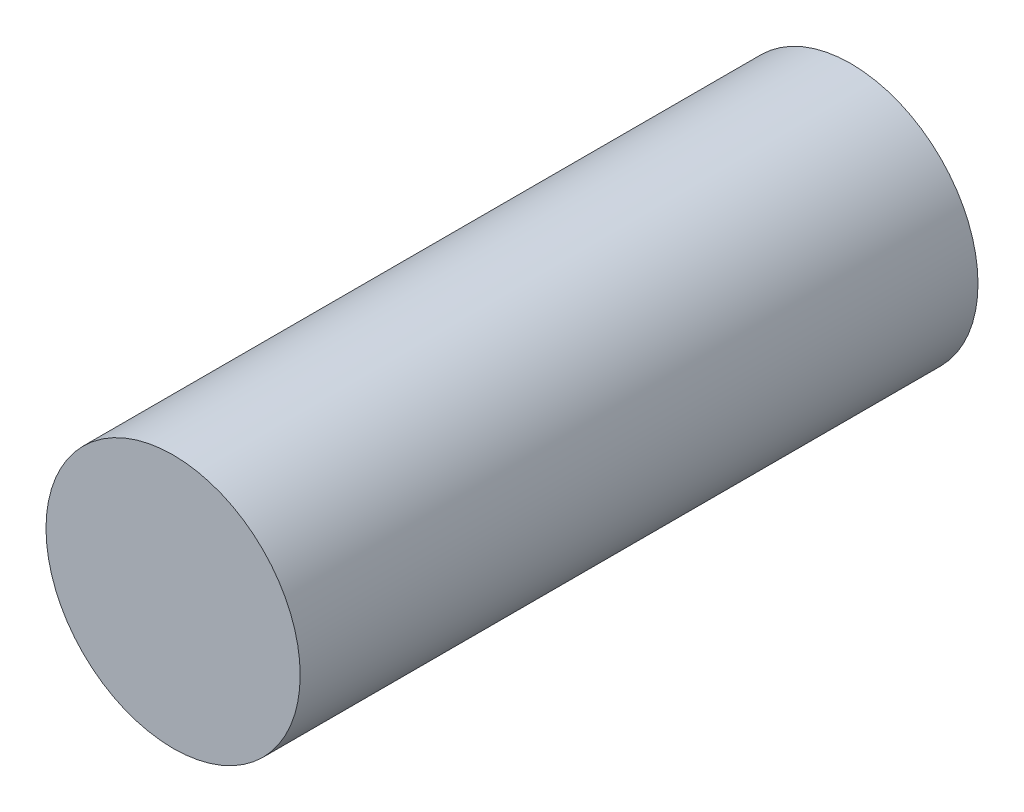
ISO-10303-21;
HEADER;
FILE_DESCRIPTION(('STEP AP214'),'2;1');
FILE_NAME('part.step','',(''),(''),'','','');
FILE_SCHEMA(('AUTOMOTIVE_DESIGN { 1 0 10303 214 1 1 1 1 }'));
ENDSEC;
DATA;
#1=APPLICATION_CONTEXT('core data for automotive mechanical design processes');
#2=APPLICATION_PROTOCOL_DEFINITION('international standard','automotive_design',2000,#1);
#3=PRODUCT_CONTEXT('',#1,'mechanical');
#4=PRODUCT('Part','Part','',(#3));
#5=PRODUCT_RELATED_PRODUCT_CATEGORY('part','',(#4));
#6=PRODUCT_DEFINITION_FORMATION('','',#4);
#7=PRODUCT_DEFINITION_CONTEXT('part definition',#1,'design');
#8=PRODUCT_DEFINITION('design','',#6,#7);
#9=PRODUCT_DEFINITION_SHAPE('','',#8);
#10=(LENGTH_UNIT() NAMED_UNIT(*) SI_UNIT(.MILLI.,.METRE.));
#11=(NAMED_UNIT(*) PLANE_ANGLE_UNIT() SI_UNIT($,.RADIAN.));
#12=(NAMED_UNIT(*) SI_UNIT($,.STERADIAN.) SOLID_ANGLE_UNIT());
#13=UNCERTAINTY_MEASURE_WITH_UNIT(LENGTH_MEASURE(1.E-05),#10,'distance_accuracy_value','');
#14=(GEOMETRIC_REPRESENTATION_CONTEXT(3) GLOBAL_UNCERTAINTY_ASSIGNED_CONTEXT((#13)) GLOBAL_UNIT_ASSIGNED_CONTEXT((#10,
#11,#12)) REPRESENTATION_CONTEXT('',''));
#15=CARTESIAN_POINT('',(0.,0.,0.));
#16=DIRECTION('',(0.,0.,1.));
#17=DIRECTION('',(1.,0.,0.));
#18=AXIS2_PLACEMENT_3D('',#15,#16,#17);
#19=CARTESIAN_POINT('',(0.75000104,0.,0.));
#20=DIRECTION('',(0.,0.,-1.));
#21=DIRECTION('',(-1.,0.,0.));
#22=AXIS2_PLACEMENT_3D('',#19,#20,#21);
#23=PLANE('',#22);
#24=CARTESIAN_POINT('',(0.,0.,0.));
#25=DIRECTION('',(0.,0.,-1.));
#26=DIRECTION('',(-1.,0.,0.));
#27=AXIS2_PLACEMENT_3D('',#24,#25,#26);
#28=CIRCLE('',#27,0.75000104);
#29=CARTESIAN_POINT('',(-0.75000104,0.,0.));
#30=VERTEX_POINT('',#29);
#31=EDGE_CURVE('E18',#30,#30,#28,.F.);
#32=ORIENTED_EDGE('',*,*,#31,.F.);
#33=EDGE_LOOP('',(#32));
#34=FACE_BOUND('',#33,.T.);
#35=ADVANCED_FACE('F15',(#34),#23,.T.);
#36=CARTESIAN_POINT('',(0.75000104,0.,3.99999962));
#37=DIRECTION('',(0.,0.,-1.));
#38=DIRECTION('',(-1.,0.,0.));
#39=AXIS2_PLACEMENT_3D('',#36,#37,#38);
#40=PLANE('',#39);
#41=CARTESIAN_POINT('',(0.,0.,3.99999962));
#42=DIRECTION('',(0.,0.,-1.));
#43=DIRECTION('',(-1.,0.,0.));
#44=AXIS2_PLACEMENT_3D('',#41,#42,#43);
#45=CIRCLE('',#44,0.75000104);
#46=CARTESIAN_POINT('',(-0.75000104,0.,3.99999962));
#47=VERTEX_POINT('',#46);
#48=EDGE_CURVE('E10',#47,#47,#45,.T.);
#49=ORIENTED_EDGE('',*,*,#48,.F.);
#50=EDGE_LOOP('',(#49));
#51=FACE_BOUND('',#50,.T.);
#52=ADVANCED_FACE('F30',(#51),#40,.F.);
#53=CARTESIAN_POINT('',(0.,0.,0.));
#54=DIRECTION('',(0.,0.,-1.));
#55=DIRECTION('',(-1.,0.,0.));
#56=AXIS2_PLACEMENT_3D('',#53,#54,#55);
#57=CYLINDRICAL_SURFACE('',#56,0.75000104);
#58=ORIENTED_EDGE('',*,*,#48,.T.);
#59=EDGE_LOOP('',(#58));
#60=FACE_BOUND('',#59,.T.);
#61=ORIENTED_EDGE('',*,*,#31,.T.);
#62=EDGE_LOOP('',(#61));
#63=FACE_BOUND('',#62,.T.);
#64=ADVANCED_FACE('F27',(#60,#63),#57,.T.);
#65=CLOSED_SHELL('',(#35,#52,#64));
#66=MANIFOLD_SOLID_BREP('B1',#65);
#67=ADVANCED_BREP_SHAPE_REPRESENTATION('',(#18,#66),#14);
#68=SHAPE_DEFINITION_REPRESENTATION(#9,#67);
ENDSEC;
END-ISO-10303-21;
